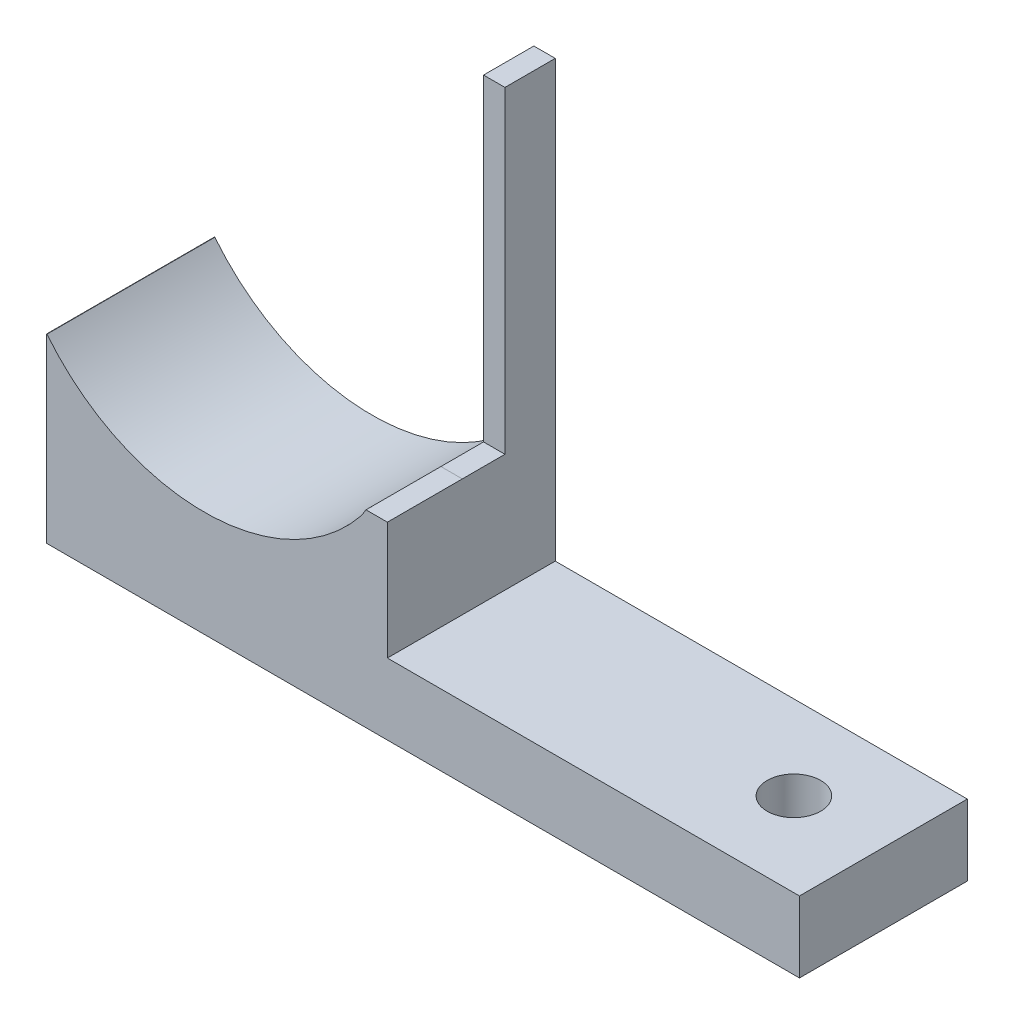
ISO-10303-21;
HEADER;
FILE_DESCRIPTION(('STEP AP214'),'2;1');
FILE_NAME('part.step','',(''),(''),'','','');
FILE_SCHEMA(('AUTOMOTIVE_DESIGN { 1 0 10303 214 1 1 1 1 }'));
ENDSEC;
DATA;
#1=APPLICATION_CONTEXT('core data for automotive mechanical design processes');
#2=APPLICATION_PROTOCOL_DEFINITION('international standard','automotive_design',2000,#1);
#3=PRODUCT_CONTEXT('',#1,'mechanical');
#4=PRODUCT('Part','Part','',(#3));
#5=PRODUCT_RELATED_PRODUCT_CATEGORY('part','',(#4));
#6=PRODUCT_DEFINITION_FORMATION('','',#4);
#7=PRODUCT_DEFINITION_CONTEXT('part definition',#1,'design');
#8=PRODUCT_DEFINITION('design','',#6,#7);
#9=PRODUCT_DEFINITION_SHAPE('','',#8);
#10=(LENGTH_UNIT() NAMED_UNIT(*) SI_UNIT(.MILLI.,.METRE.));
#11=(NAMED_UNIT(*) PLANE_ANGLE_UNIT() SI_UNIT($,.RADIAN.));
#12=(NAMED_UNIT(*) SI_UNIT($,.STERADIAN.) SOLID_ANGLE_UNIT());
#13=UNCERTAINTY_MEASURE_WITH_UNIT(LENGTH_MEASURE(1.E-05),#10,'distance_accuracy_value','');
#14=(GEOMETRIC_REPRESENTATION_CONTEXT(3) GLOBAL_UNCERTAINTY_ASSIGNED_CONTEXT((#13)) GLOBAL_UNIT_ASSIGNED_CONTEXT((#10,
#11,#12)) REPRESENTATION_CONTEXT('',''));
#15=CARTESIAN_POINT('',(0.,0.,0.));
#16=DIRECTION('',(0.,0.,1.));
#17=DIRECTION('',(1.,0.,0.));
#18=AXIS2_PLACEMENT_3D('',#15,#16,#17);
#19=CARTESIAN_POINT('',(-21.1,5.95,4.705));
#20=DIRECTION('',(1.,0.,0.));
#21=DIRECTION('',(0.,0.,-1.));
#22=AXIS2_PLACEMENT_3D('',#19,#20,#21);
#23=PLANE('',#22);
#24=DIRECTION('',(0.,0.,1.));
#25=VECTOR('',#24,1.);
#26=CARTESIAN_POINT('',(-21.1,10.17,-4.705));
#27=LINE('',#26,#25);
#28=CARTESIAN_POINT('',(-21.1,10.17,-4.705));
#29=VERTEX_POINT('',#28);
#30=CARTESIAN_POINT('',(-21.1,10.17,4.705));
#31=VERTEX_POINT('',#30);
#32=EDGE_CURVE('E259',#29,#31,#27,.T.);
#33=ORIENTED_EDGE('',*,*,#32,.F.);
#34=DIRECTION('',(0.,-1.,0.));
#35=VECTOR('',#34,1.);
#36=CARTESIAN_POINT('',(-21.1,5.95,-4.705));
#37=LINE('',#36,#35);
#38=CARTESIAN_POINT('',(-21.1,0.,-4.705));
#39=VERTEX_POINT('',#38);
#40=EDGE_CURVE('E306',#29,#39,#37,.T.);
#41=ORIENTED_EDGE('',*,*,#40,.T.);
#42=DIRECTION('',(0.,0.,1.));
#43=VECTOR('',#42,1.);
#44=CARTESIAN_POINT('',(-21.1,0.,4.705));
#45=LINE('',#44,#43);
#46=CARTESIAN_POINT('',(-21.1,0.,4.705));
#47=VERTEX_POINT('',#46);
#48=EDGE_CURVE('E294',#39,#47,#45,.T.);
#49=ORIENTED_EDGE('',*,*,#48,.T.);
#50=DIRECTION('',(0.,-1.,0.));
#51=VECTOR('',#50,1.);
#52=CARTESIAN_POINT('',(-21.1,5.95,4.705));
#53=LINE('',#52,#51);
#54=EDGE_CURVE('E303',#31,#47,#53,.T.);
#55=ORIENTED_EDGE('',*,*,#54,.F.);
#56=EDGE_LOOP('',(#33,#41,#49,#55));
#57=FACE_BOUND('',#56,.T.);
#58=ADVANCED_FACE('F45',(#57),#23,.F.);
#59=CARTESIAN_POINT('',(-21.1,5.95,4.705));
#60=DIRECTION('',(0.,0.,-1.));
#61=DIRECTION('',(-1.,0.,0.));
#62=AXIS2_PLACEMENT_3D('',#59,#60,#61);
#63=PLANE('',#62);
#64=DIRECTION('',(0.,-1.,0.));
#65=VECTOR('',#64,1.);
#66=CARTESIAN_POINT('',(21.1,5.95,4.705));
#67=LINE('',#66,#65);
#68=CARTESIAN_POINT('',(21.1,3.98345386,4.705));
#69=VERTEX_POINT('',#68);
#70=CARTESIAN_POINT('',(21.1,0.,4.705));
#71=VERTEX_POINT('',#70);
#72=EDGE_CURVE('E183',#69,#71,#67,.T.);
#73=ORIENTED_EDGE('',*,*,#72,.F.);
#74=DIRECTION('',(1.,0.,0.));
#75=VECTOR('',#74,1.);
#76=CARTESIAN_POINT('',(-2.,3.98345386,4.705));
#77=LINE('',#76,#75);
#78=CARTESIAN_POINT('',(-2.,3.98345386,4.705));
#79=VERTEX_POINT('',#78);
#80=EDGE_CURVE('E173',#79,#69,#77,.T.);
#81=ORIENTED_EDGE('',*,*,#80,.F.);
#82=DIRECTION('',(0.,-1.,0.));
#83=VECTOR('',#82,1.);
#84=CARTESIAN_POINT('',(-2.,5.95,4.705));
#85=LINE('',#84,#83);
#86=CARTESIAN_POINT('',(-2.,10.58,4.705));
#87=VERTEX_POINT('',#86);
#88=EDGE_CURVE('E155',#87,#79,#85,.T.);
#89=ORIENTED_EDGE('',*,*,#88,.F.);
#90=DIRECTION('',(1.,0.,0.));
#91=VECTOR('',#90,1.);
#92=CARTESIAN_POINT('',(-3.2,10.58,4.705));
#93=LINE('',#92,#91);
#94=CARTESIAN_POINT('',(-3.2,10.58,4.705));
#95=VERTEX_POINT('',#94);
#96=EDGE_CURVE('E226',#95,#87,#93,.T.);
#97=ORIENTED_EDGE('',*,*,#96,.F.);
#98=DIRECTION('',(0.,1.,0.));
#99=VECTOR('',#98,1.);
#100=CARTESIAN_POINT('',(-3.2,10.58,4.705));
#101=LINE('',#100,#99);
#102=CARTESIAN_POINT('',(-3.2,10.5802494226186,4.705));
#103=VERTEX_POINT('',#102);
#104=EDGE_CURVE('E235',#95,#103,#101,.T.);
#105=ORIENTED_EDGE('',*,*,#104,.T.);
#106=DIRECTION('',(-0.528527877672517,-0.848915945499309,0.));
#107=VECTOR('',#106,1.);
#108=CARTESIAN_POINT('',(-3.45541781586568,10.17,4.705));
#109=LINE('',#108,#107);
#110=CARTESIAN_POINT('',(-3.45541781586568,10.17,4.705));
#111=VERTEX_POINT('',#110);
#112=EDGE_CURVE('E240',#103,#111,#109,.T.);
#113=ORIENTED_EDGE('',*,*,#112,.T.);
#114=CARTESIAN_POINT('',(-12.2717210766866,17.2209496959156,4.705));
#115=DIRECTION('',(0.,0.,-1.));
#116=DIRECTION('',(-1.,0.,0.));
#117=AXIS2_PLACEMENT_3D('',#114,#115,#116);
#118=CIRCLE('',#117,11.2890697048559);
#119=CARTESIAN_POINT('',(-21.0878956375474,10.1698390803086,4.705));
#120=VERTEX_POINT('',#119);
#121=EDGE_CURVE('E54',#111,#120,#118,.T.);
#122=ORIENTED_EDGE('',*,*,#121,.T.);
#123=DIRECTION('',(0.99982784744258,0.0185546619030557,0.));
#124=VECTOR('',#123,1.);
#125=CARTESIAN_POINT('',(-21.1782800410381,10.168161739502,4.705));
#126=LINE('',#125,#124);
#127=CARTESIAN_POINT('',(-21.0792243941969,10.17,4.705));
#128=VERTEX_POINT('',#127);
#129=EDGE_CURVE('E312',#120,#128,#126,.T.);
#130=ORIENTED_EDGE('',*,*,#129,.T.);
#131=DIRECTION('',(1.,0.,0.));
#132=VECTOR('',#131,1.);
#133=CARTESIAN_POINT('',(-21.1,10.17,4.705));
#134=LINE('',#133,#132);
#135=EDGE_CURVE('E262',#31,#128,#134,.T.);
#136=ORIENTED_EDGE('',*,*,#135,.F.);
#137=ORIENTED_EDGE('',*,*,#54,.T.);
#138=DIRECTION('',(1.,0.,0.));
#139=VECTOR('',#138,1.);
#140=CARTESIAN_POINT('',(-21.1,0.,4.705));
#141=LINE('',#140,#139);
#142=EDGE_CURVE('E298',#47,#71,#141,.T.);
#143=ORIENTED_EDGE('',*,*,#142,.T.);
#144=EDGE_LOOP('',(#73,#81,#89,#97,#105,#113,#122,#130,#136,#137,#143));
#145=FACE_BOUND('',#144,.T.);
#146=ADVANCED_FACE('F181',(#145),#63,.F.);
#147=CARTESIAN_POINT('',(-12.2717210766866,17.2209496959156,15.295));
#148=DIRECTION('',(0.,0.,-1.));
#149=DIRECTION('',(-1.,0.,0.));
#150=AXIS2_PLACEMENT_3D('',#147,#148,#149);
#151=CYLINDRICAL_SURFACE('',#150,11.2890697048559);
#152=DIRECTION('',(0.,0.,-1.));
#153=VECTOR('',#152,1.);
#154=CARTESIAN_POINT('',(-3.45541781586567,10.17,15.295));
#155=LINE('',#154,#153);
#156=CARTESIAN_POINT('',(-3.45541781586567,10.17,-4.705));
#157=VERTEX_POINT('',#156);
#158=EDGE_CURVE('E270',#157,#111,#155,.F.);
#159=ORIENTED_EDGE('',*,*,#158,.F.);
#160=CARTESIAN_POINT('',(-12.2717210766866,17.2209496959156,-4.705));
#161=DIRECTION('',(0.,0.,-1.));
#162=DIRECTION('',(-1.,0.,0.));
#163=AXIS2_PLACEMENT_3D('',#160,#161,#162);
#164=CIRCLE('',#163,11.2890697048559);
#165=CARTESIAN_POINT('',(-21.0878956375474,10.1698390803086,-4.705));
#166=VERTEX_POINT('',#165);
#167=EDGE_CURVE('E274',#157,#166,#164,.T.);
#168=ORIENTED_EDGE('',*,*,#167,.T.);
#169=DIRECTION('',(0.,0.,-1.));
#170=VECTOR('',#169,1.);
#171=CARTESIAN_POINT('',(-21.0878956375474,10.1698390803086,15.295));
#172=LINE('',#171,#170);
#173=EDGE_CURVE('E168',#120,#166,#172,.T.);
#174=ORIENTED_EDGE('',*,*,#173,.F.);
#175=ORIENTED_EDGE('',*,*,#121,.F.);
#176=EDGE_LOOP('',(#159,#168,#174,#175));
#177=FACE_BOUND('',#176,.T.);
#178=ADVANCED_FACE('F325',(#177),#151,.F.);
#179=CARTESIAN_POINT('',(-3.2,10.5018000839562,15.295));
#180=DIRECTION('',(-0.0185546619030557,0.99982784744258,0.));
#181=DIRECTION('',(-0.99982784744258,-0.0185546619030557,0.));
#182=AXIS2_PLACEMENT_3D('',#179,#180,#181);
#183=PLANE('',#182);
#184=DIRECTION('',(0.,0.,-1.));
#185=VECTOR('',#184,1.);
#186=CARTESIAN_POINT('',(-21.0792243941969,10.17,15.295));
#187=LINE('',#186,#185);
#188=CARTESIAN_POINT('',(-21.0792243941969,10.17,-4.705));
#189=VERTEX_POINT('',#188);
#190=EDGE_CURVE('E11',#128,#189,#187,.T.);
#191=ORIENTED_EDGE('',*,*,#190,.F.);
#192=ORIENTED_EDGE('',*,*,#129,.F.);
#193=ORIENTED_EDGE('',*,*,#173,.T.);
#194=DIRECTION('',(0.99982784744258,0.0185546619030557,0.));
#195=VECTOR('',#194,1.);
#196=CARTESIAN_POINT('',(-3.2,10.5018000839562,-4.705));
#197=LINE('',#196,#195);
#198=EDGE_CURVE('E277',#166,#189,#197,.T.);
#199=ORIENTED_EDGE('',*,*,#198,.T.);
#200=EDGE_LOOP('',(#191,#192,#193,#199));
#201=FACE_BOUND('',#200,.T.);
#202=ADVANCED_FACE('F323',(#201),#183,.F.);
#203=CARTESIAN_POINT('',(21.1,5.95,4.705));
#204=DIRECTION('',(-1.,0.,0.));
#205=DIRECTION('',(0.,0.,1.));
#206=AXIS2_PLACEMENT_3D('',#203,#204,#205);
#207=PLANE('',#206);
#208=DIRECTION('',(0.,-1.,0.));
#209=VECTOR('',#208,1.);
#210=CARTESIAN_POINT('',(21.1,5.95,-4.705));
#211=LINE('',#210,#209);
#212=CARTESIAN_POINT('',(21.1,3.98345386,-4.705));
#213=VERTEX_POINT('',#212);
#214=CARTESIAN_POINT('',(21.1,0.,-4.705));
#215=VERTEX_POINT('',#214);
#216=EDGE_CURVE('E309',#213,#215,#211,.T.);
#217=ORIENTED_EDGE('',*,*,#216,.F.);
#218=DIRECTION('',(0.,0.,-1.));
#219=VECTOR('',#218,1.);
#220=CARTESIAN_POINT('',(21.1,3.98345386,4.705));
#221=LINE('',#220,#219);
#222=EDGE_CURVE('E178',#69,#213,#221,.T.);
#223=ORIENTED_EDGE('',*,*,#222,.F.);
#224=ORIENTED_EDGE('',*,*,#72,.T.);
#225=DIRECTION('',(0.,0.,-1.));
#226=VECTOR('',#225,1.);
#227=CARTESIAN_POINT('',(21.1,0.,4.705));
#228=LINE('',#227,#226);
#229=EDGE_CURVE('E286',#71,#215,#228,.T.);
#230=ORIENTED_EDGE('',*,*,#229,.T.);
#231=EDGE_LOOP('',(#217,#223,#224,#230));
#232=FACE_BOUND('',#231,.T.);
#233=ADVANCED_FACE('F47',(#232),#207,.F.);
#234=CARTESIAN_POINT('',(-21.1,5.95,-4.705));
#235=DIRECTION('',(0.,0.,1.));
#236=DIRECTION('',(1.,0.,0.));
#237=AXIS2_PLACEMENT_3D('',#234,#235,#236);
#238=PLANE('',#237);
#239=DIRECTION('',(0.,-1.,0.));
#240=VECTOR('',#239,1.);
#241=CARTESIAN_POINT('',(-2.,5.95000000000001,-4.705));
#242=LINE('',#241,#240);
#243=CARTESIAN_POINT('',(-2.00000000000001,28.39088731,-4.705));
#244=VERTEX_POINT('',#243);
#245=CARTESIAN_POINT('',(-2.,3.98345386,-4.705));
#246=VERTEX_POINT('',#245);
#247=EDGE_CURVE('E167',#244,#246,#242,.T.);
#248=ORIENTED_EDGE('',*,*,#247,.T.);
#249=DIRECTION('',(1.,0.,0.));
#250=VECTOR('',#249,1.);
#251=CARTESIAN_POINT('',(-2.,3.98345386,-4.705));
#252=LINE('',#251,#250);
#253=EDGE_CURVE('E176',#246,#213,#252,.T.);
#254=ORIENTED_EDGE('',*,*,#253,.T.);
#255=ORIENTED_EDGE('',*,*,#216,.T.);
#256=DIRECTION('',(-1.,0.,0.));
#257=VECTOR('',#256,1.);
#258=CARTESIAN_POINT('',(-21.1,0.,-4.705));
#259=LINE('',#258,#257);
#260=EDGE_CURVE('E290',#215,#39,#259,.T.);
#261=ORIENTED_EDGE('',*,*,#260,.T.);
#262=ORIENTED_EDGE('',*,*,#40,.F.);
#263=DIRECTION('',(-1.,0.,0.));
#264=VECTOR('',#263,1.);
#265=CARTESIAN_POINT('',(-21.1,10.17,-4.705));
#266=LINE('',#265,#264);
#267=EDGE_CURVE('E265',#189,#29,#266,.T.);
#268=ORIENTED_EDGE('',*,*,#267,.F.);
#269=ORIENTED_EDGE('',*,*,#198,.F.);
#270=ORIENTED_EDGE('',*,*,#167,.F.);
#271=DIRECTION('',(-0.528527877672517,-0.848915945499309,0.));
#272=VECTOR('',#271,1.);
#273=CARTESIAN_POINT('',(-3.45541781586568,10.17,-4.705));
#274=LINE('',#273,#272);
#275=CARTESIAN_POINT('',(-3.2,10.5802494226186,-4.705));
#276=VERTEX_POINT('',#275);
#277=EDGE_CURVE('E248',#276,#157,#274,.T.);
#278=ORIENTED_EDGE('',*,*,#277,.F.);
#279=DIRECTION('',(0.,1.,0.));
#280=VECTOR('',#279,1.);
#281=CARTESIAN_POINT('',(-3.2,10.17,-4.705));
#282=LINE('',#281,#280);
#283=CARTESIAN_POINT('',(-3.2,28.39088731,-4.705));
#284=VERTEX_POINT('',#283);
#285=EDGE_CURVE('E69',#276,#284,#282,.T.);
#286=ORIENTED_EDGE('',*,*,#285,.T.);
#287=DIRECTION('',(1.,0.,0.));
#288=VECTOR('',#287,1.);
#289=CARTESIAN_POINT('',(-21.74,28.39088731,-4.705));
#290=LINE('',#289,#288);
#291=EDGE_CURVE('E215',#284,#244,#290,.T.);
#292=ORIENTED_EDGE('',*,*,#291,.T.);
#293=EDGE_LOOP('',(#248,#254,#255,#261,#262,#268,#269,#270,#278,#286,#292));
#294=FACE_BOUND('',#293,.T.);
#295=ADVANCED_FACE('F329',(#294),#238,.F.);
#296=CARTESIAN_POINT('',(0.,0.,0.));
#297=DIRECTION('',(0.,-1.,0.));
#298=DIRECTION('',(0.,0.,-1.));
#299=AXIS2_PLACEMENT_3D('',#296,#297,#298);
#300=PLANE('',#299);
#301=CARTESIAN_POINT('',(16.0834175443182,0.,0.));
#302=DIRECTION('',(0.,-1.,0.));
#303=DIRECTION('',(0.,0.,-1.));
#304=AXIS2_PLACEMENT_3D('',#301,#302,#303);
#305=CIRCLE('',#304,1.5);
#306=CARTESIAN_POINT('',(16.0834175443182,0.,-1.5));
#307=VERTEX_POINT('',#306);
#308=EDGE_CURVE('E543',#307,#307,#305,.T.);
#309=ORIENTED_EDGE('',*,*,#308,.F.);
#310=EDGE_LOOP('',(#309));
#311=FACE_BOUND('',#310,.T.);
#312=ORIENTED_EDGE('',*,*,#229,.F.);
#313=ORIENTED_EDGE('',*,*,#142,.F.);
#314=ORIENTED_EDGE('',*,*,#48,.F.);
#315=ORIENTED_EDGE('',*,*,#260,.F.);
#316=EDGE_LOOP('',(#312,#313,#314,#315));
#317=FACE_BOUND('',#316,.T.);
#318=ADVANCED_FACE('F371',(#311,#317),#300,.T.);
#319=CARTESIAN_POINT('',(-2.,5.95,-5.295));
#320=DIRECTION('',(-1.,0.,0.));
#321=DIRECTION('',(0.,-1.,0.));
#322=AXIS2_PLACEMENT_3D('',#319,#320,#321);
#323=PLANE('',#322);
#324=DIRECTION('',(0.,0.,-1.));
#325=VECTOR('',#324,1.);
#326=CARTESIAN_POINT('',(-2.00000000000001,28.39088731,0.504999999999998));
#327=LINE('',#326,#325);
#328=CARTESIAN_POINT('',(-2.00000000000001,28.39088731,-1.885));
#329=VERTEX_POINT('',#328);
#330=EDGE_CURVE('E210',#329,#244,#327,.T.);
#331=ORIENTED_EDGE('',*,*,#330,.F.);
#332=DIRECTION('',(0.,1.,0.));
#333=VECTOR('',#332,1.);
#334=CARTESIAN_POINT('',(-2.,10.5802494226186,-1.885));
#335=LINE('',#334,#333);
#336=CARTESIAN_POINT('',(-2.,10.5802494226186,-1.885));
#337=VERTEX_POINT('',#336);
#338=EDGE_CURVE('E61',#337,#329,#335,.T.);
#339=ORIENTED_EDGE('',*,*,#338,.F.);
#340=DIRECTION('',(0.,0.,-1.));
#341=VECTOR('',#340,1.);
#342=CARTESIAN_POINT('',(-2.,10.5802494226186,0.504999999999999));
#343=LINE('',#342,#341);
#344=CARTESIAN_POINT('',(-2.,10.5802494226186,0.504999999999999));
#345=VERTEX_POINT('',#344);
#346=EDGE_CURVE('E197',#345,#337,#343,.T.);
#347=ORIENTED_EDGE('',*,*,#346,.F.);
#348=DIRECTION('',(0.,1.,0.));
#349=VECTOR('',#348,1.);
#350=CARTESIAN_POINT('',(-2.,10.58,0.504999999999999));
#351=LINE('',#350,#349);
#352=CARTESIAN_POINT('',(-2.,10.58,0.504999999999999));
#353=VERTEX_POINT('',#352);
#354=EDGE_CURVE('E241',#353,#345,#351,.T.);
#355=ORIENTED_EDGE('',*,*,#354,.F.);
#356=DIRECTION('',(0.,0.,-1.));
#357=VECTOR('',#356,1.);
#358=CARTESIAN_POINT('',(-2.,10.58,4.705));
#359=LINE('',#358,#357);
#360=EDGE_CURVE('E162',#87,#353,#359,.T.);
#361=ORIENTED_EDGE('',*,*,#360,.F.);
#362=ORIENTED_EDGE('',*,*,#88,.T.);
#363=DIRECTION('',(0.,0.,-1.));
#364=VECTOR('',#363,1.);
#365=CARTESIAN_POINT('',(-2.,3.98345386,4.705));
#366=LINE('',#365,#364);
#367=EDGE_CURVE('E160',#79,#246,#366,.T.);
#368=ORIENTED_EDGE('',*,*,#367,.T.);
#369=ORIENTED_EDGE('',*,*,#247,.F.);
#370=EDGE_LOOP('',(#331,#339,#347,#355,#361,#362,#368,#369));
#371=FACE_BOUND('',#370,.T.);
#372=ADVANCED_FACE('F158',(#371),#323,.F.);
#373=CARTESIAN_POINT('',(0.,10.17,0.));
#374=DIRECTION('',(0.,1.,0.));
#375=DIRECTION('',(0.,0.,1.));
#376=AXIS2_PLACEMENT_3D('',#373,#374,#375);
#377=PLANE('',#376);
#378=ORIENTED_EDGE('',*,*,#190,.T.);
#379=ORIENTED_EDGE('',*,*,#267,.T.);
#380=ORIENTED_EDGE('',*,*,#32,.T.);
#381=ORIENTED_EDGE('',*,*,#135,.T.);
#382=EDGE_LOOP('',(#378,#379,#380,#381));
#383=FACE_BOUND('',#382,.T.);
#384=ADVANCED_FACE('F391',(#383),#377,.T.);
#385=CARTESIAN_POINT('',(-3.2,10.17,-4.705));
#386=DIRECTION('',(1.,0.,0.));
#387=DIRECTION('',(0.,0.,-1.));
#388=AXIS2_PLACEMENT_3D('',#385,#386,#387);
#389=PLANE('',#388);
#390=DIRECTION('',(0.,0.,1.));
#391=VECTOR('',#390,1.);
#392=CARTESIAN_POINT('',(-3.2,10.5802494226186,-4.705));
#393=LINE('',#392,#391);
#394=CARTESIAN_POINT('',(-3.19999999999999,10.5802494226186,-1.885));
#395=VERTEX_POINT('',#394);
#396=EDGE_CURVE('E256',#276,#395,#393,.T.);
#397=ORIENTED_EDGE('',*,*,#396,.T.);
#398=DIRECTION('',(0.,1.,0.));
#399=VECTOR('',#398,1.);
#400=CARTESIAN_POINT('',(-3.19999999999999,10.5802494226186,-1.885));
#401=LINE('',#400,#399);
#402=CARTESIAN_POINT('',(-3.2,28.39088731,-1.885));
#403=VERTEX_POINT('',#402);
#404=EDGE_CURVE('E206',#395,#403,#401,.T.);
#405=ORIENTED_EDGE('',*,*,#404,.T.);
#406=DIRECTION('',(0.,0.,-1.));
#407=VECTOR('',#406,1.);
#408=CARTESIAN_POINT('',(-3.2,28.39088731,-4.705));
#409=LINE('',#408,#407);
#410=EDGE_CURVE('E219',#403,#284,#409,.T.);
#411=ORIENTED_EDGE('',*,*,#410,.T.);
#412=ORIENTED_EDGE('',*,*,#285,.F.);
#413=EDGE_LOOP('',(#397,#405,#411,#412));
#414=FACE_BOUND('',#413,.T.);
#415=ADVANCED_FACE('F335',(#414),#389,.F.);
#416=CARTESIAN_POINT('',(-3.45541781586568,10.17,-4.705));
#417=DIRECTION('',(-0.848915945499309,0.528527877672517,0.));
#418=DIRECTION('',(-0.528527877672517,-0.848915945499309,0.));
#419=AXIS2_PLACEMENT_3D('',#416,#417,#418);
#420=PLANE('',#419);
#421=ORIENTED_EDGE('',*,*,#112,.F.);
#422=CARTESIAN_POINT('',(-3.19999999999999,10.5802494226186,0.504999999999999));
#423=VERTEX_POINT('',#422);
#424=EDGE_CURVE('E252',#423,#103,#393,.T.);
#425=ORIENTED_EDGE('',*,*,#424,.F.);
#426=DIRECTION('',(0.,0.,1.));
#427=VECTOR('',#426,1.);
#428=CARTESIAN_POINT('',(-3.19999999999999,10.5802494226186,0.504999999999999));
#429=LINE('',#428,#427);
#430=EDGE_CURVE('E191',#395,#423,#429,.T.);
#431=ORIENTED_EDGE('',*,*,#430,.F.);
#432=ORIENTED_EDGE('',*,*,#396,.F.);
#433=ORIENTED_EDGE('',*,*,#277,.T.);
#434=ORIENTED_EDGE('',*,*,#158,.T.);
#435=EDGE_LOOP('',(#421,#425,#431,#432,#433,#434));
#436=FACE_BOUND('',#435,.T.);
#437=ADVANCED_FACE('F332',(#436),#420,.T.);
#438=CARTESIAN_POINT('',(-3.2,10.58,4.705));
#439=DIRECTION('',(-1.,0.,0.));
#440=DIRECTION('',(0.,0.,1.));
#441=AXIS2_PLACEMENT_3D('',#438,#439,#440);
#442=PLANE('',#441);
#443=ORIENTED_EDGE('',*,*,#424,.T.);
#444=ORIENTED_EDGE('',*,*,#104,.F.);
#445=DIRECTION('',(0.,0.,1.));
#446=VECTOR('',#445,1.);
#447=CARTESIAN_POINT('',(-3.2,10.58,4.705));
#448=LINE('',#447,#446);
#449=CARTESIAN_POINT('',(-3.2,10.58,0.504999999999999));
#450=VERTEX_POINT('',#449);
#451=EDGE_CURVE('E222',#450,#95,#448,.T.);
#452=ORIENTED_EDGE('',*,*,#451,.F.);
#453=DIRECTION('',(0.,1.,0.));
#454=VECTOR('',#453,1.);
#455=CARTESIAN_POINT('',(-3.2,10.58,0.504999999999999));
#456=LINE('',#455,#454);
#457=EDGE_CURVE('E236',#450,#423,#456,.T.);
#458=ORIENTED_EDGE('',*,*,#457,.T.);
#459=EDGE_LOOP('',(#443,#444,#452,#458));
#460=FACE_BOUND('',#459,.T.);
#461=ADVANCED_FACE('F351',(#460),#442,.F.);
#462=CARTESIAN_POINT('',(-3.2,10.58,0.504999999999999));
#463=DIRECTION('',(0.,0.,-1.));
#464=DIRECTION('',(-1.,0.,0.));
#465=AXIS2_PLACEMENT_3D('',#462,#463,#464);
#466=PLANE('',#465);
#467=ORIENTED_EDGE('',*,*,#354,.T.);
#468=DIRECTION('',(1.,0.,0.));
#469=VECTOR('',#468,1.);
#470=CARTESIAN_POINT('',(-3.19999999999999,10.5802494226186,0.504999999999999));
#471=LINE('',#470,#469);
#472=EDGE_CURVE('E194',#423,#345,#471,.T.);
#473=ORIENTED_EDGE('',*,*,#472,.F.);
#474=ORIENTED_EDGE('',*,*,#457,.F.);
#475=DIRECTION('',(-1.,0.,0.));
#476=VECTOR('',#475,1.);
#477=CARTESIAN_POINT('',(-3.2,10.58,0.504999999999999));
#478=LINE('',#477,#476);
#479=EDGE_CURVE('E231',#353,#450,#478,.T.);
#480=ORIENTED_EDGE('',*,*,#479,.F.);
#481=EDGE_LOOP('',(#467,#473,#474,#480));
#482=FACE_BOUND('',#481,.T.);
#483=ADVANCED_FACE('F345',(#482),#466,.F.);
#484=CARTESIAN_POINT('',(0.,10.58,0.));
#485=DIRECTION('',(0.,-1.,0.));
#486=DIRECTION('',(0.,0.,-1.));
#487=AXIS2_PLACEMENT_3D('',#484,#485,#486);
#488=PLANE('',#487);
#489=ORIENTED_EDGE('',*,*,#451,.T.);
#490=ORIENTED_EDGE('',*,*,#96,.T.);
#491=ORIENTED_EDGE('',*,*,#360,.T.);
#492=ORIENTED_EDGE('',*,*,#479,.T.);
#493=EDGE_LOOP('',(#489,#490,#491,#492));
#494=FACE_BOUND('',#493,.T.);
#495=ADVANCED_FACE('F348',(#494),#488,.F.);
#496=CARTESIAN_POINT('',(-21.74,28.39088731,0.504999999999998));
#497=DIRECTION('',(0.,-1.,0.));
#498=DIRECTION('',(1.,0.,0.));
#499=AXIS2_PLACEMENT_3D('',#496,#497,#498);
#500=PLANE('',#499);
#501=ORIENTED_EDGE('',*,*,#410,.F.);
#502=DIRECTION('',(-1.,0.,0.));
#503=VECTOR('',#502,1.);
#504=CARTESIAN_POINT('',(-3.2,28.39088731,-1.885));
#505=LINE('',#504,#503);
#506=EDGE_CURVE('E187',#329,#403,#505,.T.);
#507=ORIENTED_EDGE('',*,*,#506,.F.);
#508=ORIENTED_EDGE('',*,*,#330,.T.);
#509=ORIENTED_EDGE('',*,*,#291,.F.);
#510=EDGE_LOOP('',(#501,#507,#508,#509));
#511=FACE_BOUND('',#510,.T.);
#512=ADVANCED_FACE('F339',(#511),#500,.F.);
#513=CARTESIAN_POINT('',(-3.19999999999999,10.5802494226186,-1.885));
#514=DIRECTION('',(0.,0.,-1.));
#515=DIRECTION('',(-1.,0.,0.));
#516=AXIS2_PLACEMENT_3D('',#513,#514,#515);
#517=PLANE('',#516);
#518=ORIENTED_EDGE('',*,*,#506,.T.);
#519=ORIENTED_EDGE('',*,*,#404,.F.);
#520=DIRECTION('',(-1.,0.,0.));
#521=VECTOR('',#520,1.);
#522=CARTESIAN_POINT('',(-3.19999999999999,10.5802494226186,-1.885));
#523=LINE('',#522,#521);
#524=EDGE_CURVE('E200',#337,#395,#523,.T.);
#525=ORIENTED_EDGE('',*,*,#524,.F.);
#526=ORIENTED_EDGE('',*,*,#338,.T.);
#527=EDGE_LOOP('',(#518,#519,#525,#526));
#528=FACE_BOUND('',#527,.T.);
#529=ADVANCED_FACE('F443',(#528),#517,.F.);
#530=CARTESIAN_POINT('',(0.,10.5802494226186,0.));
#531=DIRECTION('',(0.,-1.,0.));
#532=DIRECTION('',(0.,0.,-1.));
#533=AXIS2_PLACEMENT_3D('',#530,#531,#532);
#534=PLANE('',#533);
#535=ORIENTED_EDGE('',*,*,#430,.T.);
#536=ORIENTED_EDGE('',*,*,#472,.T.);
#537=ORIENTED_EDGE('',*,*,#346,.T.);
#538=ORIENTED_EDGE('',*,*,#524,.T.);
#539=EDGE_LOOP('',(#535,#536,#537,#538));
#540=FACE_BOUND('',#539,.T.);
#541=ADVANCED_FACE('F451',(#540),#534,.F.);
#542=CARTESIAN_POINT('',(-2.,3.98345386,4.705));
#543=DIRECTION('',(0.,-1.,0.));
#544=DIRECTION('',(0.,0.,-1.));
#545=AXIS2_PLACEMENT_3D('',#542,#543,#544);
#546=PLANE('',#545);
#547=CARTESIAN_POINT('',(16.0834175443182,3.98345386,0.));
#548=DIRECTION('',(0.,1.,0.));
#549=DIRECTION('',(0.,0.,1.));
#550=AXIS2_PLACEMENT_3D('',#547,#548,#549);
#551=CIRCLE('',#550,1.5);
#552=CARTESIAN_POINT('',(16.0834175443182,3.98345386,1.5));
#553=VERTEX_POINT('',#552);
#554=EDGE_CURVE('E546',#553,#553,#551,.T.);
#555=ORIENTED_EDGE('',*,*,#554,.F.);
#556=EDGE_LOOP('',(#555));
#557=FACE_BOUND('',#556,.T.);
#558=ORIENTED_EDGE('',*,*,#222,.T.);
#559=ORIENTED_EDGE('',*,*,#253,.F.);
#560=ORIENTED_EDGE('',*,*,#367,.F.);
#561=ORIENTED_EDGE('',*,*,#80,.T.);
#562=EDGE_LOOP('',(#558,#559,#560,#561));
#563=FACE_BOUND('',#562,.T.);
#564=ADVANCED_FACE('F172',(#557,#563),#546,.F.);
#565=CARTESIAN_POINT('',(16.0834175443182,-19.11654614,0.));
#566=DIRECTION('',(0.,1.,0.));
#567=DIRECTION('',(0.,0.,1.));
#568=AXIS2_PLACEMENT_3D('',#565,#566,#567);
#569=CYLINDRICAL_SURFACE('',#568,1.5);
#570=ORIENTED_EDGE('',*,*,#308,.T.);
#571=EDGE_LOOP('',(#570));
#572=FACE_BOUND('',#571,.T.);
#573=ORIENTED_EDGE('',*,*,#554,.T.);
#574=EDGE_LOOP('',(#573));
#575=FACE_BOUND('',#574,.T.);
#576=ADVANCED_FACE('F521',(#572,#575),#569,.F.);
#577=CLOSED_SHELL('',(#58,#146,#178,#202,#233,#295,#318,#372,#384,#415,#437,#461,#483,#495,#512,
#529,#541,#564,#576));
#578=MANIFOLD_SOLID_BREP('B2',#577);
#579=ADVANCED_BREP_SHAPE_REPRESENTATION('',(#18,#578),#14);
#580=SHAPE_DEFINITION_REPRESENTATION(#9,#579);
ENDSEC;
END-ISO-10303-21;
